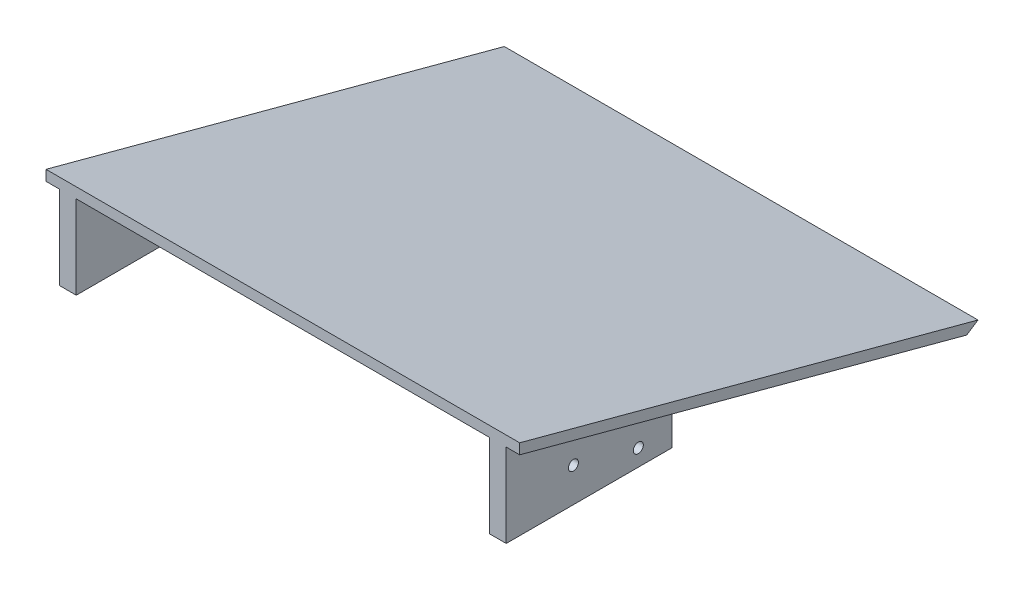
ISO-10303-21;
HEADER;
FILE_DESCRIPTION(('STEP AP214'),'2;1');
FILE_NAME('part.step','',(''),(''),'','','');
FILE_SCHEMA(('AUTOMOTIVE_DESIGN { 1 0 10303 214 1 1 1 1 }'));
ENDSEC;
DATA;
#1=APPLICATION_CONTEXT('core data for automotive mechanical design processes');
#2=APPLICATION_PROTOCOL_DEFINITION('international standard','automotive_design',2000,#1);
#3=PRODUCT_CONTEXT('',#1,'mechanical');
#4=PRODUCT('Part','Part','',(#3));
#5=PRODUCT_RELATED_PRODUCT_CATEGORY('part','',(#4));
#6=PRODUCT_DEFINITION_FORMATION('','',#4);
#7=PRODUCT_DEFINITION_CONTEXT('part definition',#1,'design');
#8=PRODUCT_DEFINITION('design','',#6,#7);
#9=PRODUCT_DEFINITION_SHAPE('','',#8);
#10=(LENGTH_UNIT() NAMED_UNIT(*) SI_UNIT(.MILLI.,.METRE.));
#11=(NAMED_UNIT(*) PLANE_ANGLE_UNIT() SI_UNIT($,.RADIAN.));
#12=(NAMED_UNIT(*) SI_UNIT($,.STERADIAN.) SOLID_ANGLE_UNIT());
#13=UNCERTAINTY_MEASURE_WITH_UNIT(LENGTH_MEASURE(1.E-05),#10,'distance_accuracy_value','');
#14=(GEOMETRIC_REPRESENTATION_CONTEXT(3) GLOBAL_UNCERTAINTY_ASSIGNED_CONTEXT((#13)) GLOBAL_UNIT_ASSIGNED_CONTEXT((#10,
#11,#12)) REPRESENTATION_CONTEXT('',''));
#15=CARTESIAN_POINT('',(0.,0.,0.));
#16=DIRECTION('',(0.,0.,1.));
#17=DIRECTION('',(1.,0.,0.));
#18=AXIS2_PLACEMENT_3D('',#15,#16,#17);
#19=CARTESIAN_POINT('',(70.5,3.10582854123023,0.));
#20=DIRECTION('',(0.,0.,-1.));
#21=DIRECTION('',(-1.,0.,0.));
#22=AXIS2_PLACEMENT_3D('',#19,#20,#21);
#23=PLANE('',#22);
#24=DIRECTION('',(0.,-1.,0.));
#25=VECTOR('',#24,1.);
#26=CARTESIAN_POINT('',(-70.5,3.10582854123023,0.));
#27=LINE('',#26,#25);
#28=CARTESIAN_POINT('',(-70.5,3.10582854123023,0.));
#29=VERTEX_POINT('',#28);
#30=CARTESIAN_POINT('',(-70.5,0.,0.));
#31=VERTEX_POINT('',#30);
#32=EDGE_CURVE('E196',#29,#31,#27,.T.);
#33=ORIENTED_EDGE('',*,*,#32,.T.);
#34=DIRECTION('',(-1.,0.,0.));
#35=VECTOR('',#34,1.);
#36=CARTESIAN_POINT('',(70.5,0.,0.));
#37=LINE('',#36,#35);
#38=CARTESIAN_POINT('',(-66.5,0.,0.));
#39=VERTEX_POINT('',#38);
#40=EDGE_CURVE('E42',#39,#31,#37,.T.);
#41=ORIENTED_EDGE('',*,*,#40,.F.);
#42=DIRECTION('',(0.,1.,0.));
#43=VECTOR('',#42,1.);
#44=CARTESIAN_POINT('',(-66.5,0.,0.));
#45=LINE('',#44,#43);
#46=CARTESIAN_POINT('',(-66.5,-24.8528503743635,0.));
#47=VERTEX_POINT('',#46);
#48=EDGE_CURVE('E176',#47,#39,#45,.T.);
#49=ORIENTED_EDGE('',*,*,#48,.F.);
#50=DIRECTION('',(-1.,0.,0.));
#51=VECTOR('',#50,1.);
#52=CARTESIAN_POINT('',(-61.5,-24.8528503743635,0.));
#53=LINE('',#52,#51);
#54=CARTESIAN_POINT('',(-61.5,-24.8528503743635,0.));
#55=VERTEX_POINT('',#54);
#56=EDGE_CURVE('E194',#55,#47,#53,.T.);
#57=ORIENTED_EDGE('',*,*,#56,.F.);
#58=DIRECTION('',(0.,1.,0.));
#59=VECTOR('',#58,1.);
#60=CARTESIAN_POINT('',(-61.5,0.,0.));
#61=LINE('',#60,#59);
#62=CARTESIAN_POINT('',(-61.5,0.,0.));
#63=VERTEX_POINT('',#62);
#64=EDGE_CURVE('E127',#55,#63,#61,.T.);
#65=ORIENTED_EDGE('',*,*,#64,.T.);
#66=CARTESIAN_POINT('',(61.5,0.,0.));
#67=VERTEX_POINT('',#66);
#68=EDGE_CURVE('E41',#67,#63,#37,.T.);
#69=ORIENTED_EDGE('',*,*,#68,.F.);
#70=DIRECTION('',(0.,1.,0.));
#71=VECTOR('',#70,1.);
#72=CARTESIAN_POINT('',(61.5,0.,0.));
#73=LINE('',#72,#71);
#74=CARTESIAN_POINT('',(61.5,-24.8528503743635,0.));
#75=VERTEX_POINT('',#74);
#76=EDGE_CURVE('E125',#75,#67,#73,.T.);
#77=ORIENTED_EDGE('',*,*,#76,.F.);
#78=DIRECTION('',(1.,0.,0.));
#79=VECTOR('',#78,1.);
#80=CARTESIAN_POINT('',(61.5,-24.8528503743635,0.));
#81=LINE('',#80,#79);
#82=CARTESIAN_POINT('',(66.5,-24.8528503743635,0.));
#83=VERTEX_POINT('',#82);
#84=EDGE_CURVE('E146',#75,#83,#81,.T.);
#85=ORIENTED_EDGE('',*,*,#84,.T.);
#86=DIRECTION('',(0.,1.,0.));
#87=VECTOR('',#86,1.);
#88=CARTESIAN_POINT('',(66.5,0.,0.));
#89=LINE('',#88,#87);
#90=CARTESIAN_POINT('',(66.5,0.,0.));
#91=VERTEX_POINT('',#90);
#92=EDGE_CURVE('E148',#83,#91,#89,.T.);
#93=ORIENTED_EDGE('',*,*,#92,.T.);
#94=CARTESIAN_POINT('',(70.5,0.,0.));
#95=VERTEX_POINT('',#94);
#96=EDGE_CURVE('E11',#95,#91,#37,.T.);
#97=ORIENTED_EDGE('',*,*,#96,.F.);
#98=DIRECTION('',(0.,-1.,0.));
#99=VECTOR('',#98,1.);
#100=CARTESIAN_POINT('',(70.5,3.10582854123023,0.));
#101=LINE('',#100,#99);
#102=CARTESIAN_POINT('',(70.5,3.10582854123023,0.));
#103=VERTEX_POINT('',#102);
#104=EDGE_CURVE('E200',#103,#95,#101,.T.);
#105=ORIENTED_EDGE('',*,*,#104,.F.);
#106=DIRECTION('',(-1.,0.,0.));
#107=VECTOR('',#106,1.);
#108=CARTESIAN_POINT('',(70.5,3.10582854123023,0.));
#109=LINE('',#108,#107);
#110=EDGE_CURVE('E210',#103,#29,#109,.T.);
#111=ORIENTED_EDGE('',*,*,#110,.T.);
#112=EDGE_LOOP('',(#33,#41,#49,#57,#65,#69,#77,#85,#93,#97,#105,#111));
#113=FACE_BOUND('',#112,.T.);
#114=ADVANCED_FACE('F34',(#113),#23,.F.);
#115=CARTESIAN_POINT('',(70.5,0.,0.));
#116=DIRECTION('',(0.,0.965925826289069,-0.258819045102518));
#117=DIRECTION('',(0.,0.258819045102518,0.965925826289069));
#118=AXIS2_PLACEMENT_3D('',#115,#116,#117);
#119=PLANE('',#118);
#120=DIRECTION('',(1.,0.,0.));
#121=VECTOR('',#120,1.);
#122=CARTESIAN_POINT('',(61.5,-13.2148566749839,-49.3185165257814));
#123=LINE('',#122,#121);
#124=CARTESIAN_POINT('',(61.5,-13.2148566749839,-49.3185165257814));
#125=VERTEX_POINT('',#124);
#126=CARTESIAN_POINT('',(66.5,-13.2148566749839,-49.3185165257814));
#127=VERTEX_POINT('',#126);
#128=EDGE_CURVE('E53',#125,#127,#123,.T.);
#129=ORIENTED_EDGE('',*,*,#128,.F.);
#130=DIRECTION('',(0.,-0.258819045102518,-0.965925826289069));
#131=VECTOR('',#130,1.);
#132=CARTESIAN_POINT('',(61.5,-13.2148566749839,-49.3185165257814));
#133=LINE('',#132,#131);
#134=EDGE_CURVE('E130',#67,#125,#133,.T.);
#135=ORIENTED_EDGE('',*,*,#134,.F.);
#136=ORIENTED_EDGE('',*,*,#68,.T.);
#137=DIRECTION('',(0.,-0.258819045102518,-0.965925826289069));
#138=VECTOR('',#137,1.);
#139=CARTESIAN_POINT('',(-61.5,-13.2148566749839,-49.3185165257814));
#140=LINE('',#139,#138);
#141=CARTESIAN_POINT('',(-61.5,-13.2148566749839,-49.3185165257814));
#142=VERTEX_POINT('',#141);
#143=EDGE_CURVE('E173',#63,#142,#140,.T.);
#144=ORIENTED_EDGE('',*,*,#143,.T.);
#145=DIRECTION('',(-1.,0.,0.));
#146=VECTOR('',#145,1.);
#147=CARTESIAN_POINT('',(-61.5,-13.2148566749839,-49.3185165257814));
#148=LINE('',#147,#146);
#149=CARTESIAN_POINT('',(-66.5,-13.2148566749839,-49.3185165257814));
#150=VERTEX_POINT('',#149);
#151=EDGE_CURVE('E183',#142,#150,#148,.T.);
#152=ORIENTED_EDGE('',*,*,#151,.T.);
#153=DIRECTION('',(0.,-0.258819045102518,-0.965925826289069));
#154=VECTOR('',#153,1.);
#155=CARTESIAN_POINT('',(-66.5,-13.2148566749839,-49.3185165257814));
#156=LINE('',#155,#154);
#157=EDGE_CURVE('E170',#39,#150,#156,.T.);
#158=ORIENTED_EDGE('',*,*,#157,.F.);
#159=ORIENTED_EDGE('',*,*,#40,.T.);
#160=DIRECTION('',(0.,-0.258819045102518,-0.965925826289069));
#161=VECTOR('',#160,1.);
#162=CARTESIAN_POINT('',(-70.5,0.,0.));
#163=LINE('',#162,#161);
#164=CARTESIAN_POINT('',(-70.5,-35.6497352724208,-133.046623313056));
#165=VERTEX_POINT('',#164);
#166=EDGE_CURVE('E212',#31,#165,#163,.T.);
#167=ORIENTED_EDGE('',*,*,#166,.T.);
#168=DIRECTION('',(-1.,0.,0.));
#169=VECTOR('',#168,1.);
#170=CARTESIAN_POINT('',(70.5,-35.6497352724208,-133.046623313056));
#171=LINE('',#170,#169);
#172=CARTESIAN_POINT('',(70.5,-35.6497352724208,-133.046623313056));
#173=VERTEX_POINT('',#172);
#174=EDGE_CURVE('E221',#173,#165,#171,.T.);
#175=ORIENTED_EDGE('',*,*,#174,.F.);
#176=DIRECTION('',(0.,-0.258819045102518,-0.965925826289069));
#177=VECTOR('',#176,1.);
#178=CARTESIAN_POINT('',(70.5,0.,0.));
#179=LINE('',#178,#177);
#180=EDGE_CURVE('E203',#95,#173,#179,.T.);
#181=ORIENTED_EDGE('',*,*,#180,.F.);
#182=ORIENTED_EDGE('',*,*,#96,.T.);
#183=DIRECTION('',(0.,-0.258819045102518,-0.965925826289069));
#184=VECTOR('',#183,1.);
#185=CARTESIAN_POINT('',(66.5,-13.2148566749839,-49.3185165257814));
#186=LINE('',#185,#184);
#187=EDGE_CURVE('E48',#91,#127,#186,.T.);
#188=ORIENTED_EDGE('',*,*,#187,.T.);
#189=EDGE_LOOP('',(#129,#135,#136,#144,#152,#158,#159,#167,#175,#181,#182,#188));
#190=FACE_BOUND('',#189,.T.);
#191=ADVANCED_FACE('F131',(#190),#119,.F.);
#192=CARTESIAN_POINT('',(70.5,-35.6497352724208,-133.046623313056));
#193=DIRECTION('',(0.,0.83867056794542,0.544639035015034));
#194=DIRECTION('',(0.,-0.544639035015034,0.83867056794542));
#195=AXIS2_PLACEMENT_3D('',#192,#193,#194);
#196=PLANE('',#195);
#197=DIRECTION('',(0.,0.544639035015034,-0.83867056794542));
#198=VECTOR('',#197,1.);
#199=CARTESIAN_POINT('',(-70.5,-35.6497352724208,-133.046623313056));
#200=LINE('',#199,#198);
#201=CARTESIAN_POINT('',(-70.5,-33.4510829384084,-136.432251009811));
#202=VERTEX_POINT('',#201);
#203=EDGE_CURVE('E214',#165,#202,#200,.T.);
#204=ORIENTED_EDGE('',*,*,#203,.T.);
#205=DIRECTION('',(-1.,0.,0.));
#206=VECTOR('',#205,1.);
#207=CARTESIAN_POINT('',(70.5,-33.4510829384084,-136.432251009811));
#208=LINE('',#207,#206);
#209=CARTESIAN_POINT('',(70.5,-33.4510829384084,-136.432251009811));
#210=VERTEX_POINT('',#209);
#211=EDGE_CURVE('E219',#210,#202,#208,.T.);
#212=ORIENTED_EDGE('',*,*,#211,.F.);
#213=DIRECTION('',(0.,0.544639035015034,-0.83867056794542));
#214=VECTOR('',#213,1.);
#215=CARTESIAN_POINT('',(70.5,-35.6497352724208,-133.046623313056));
#216=LINE('',#215,#214);
#217=EDGE_CURVE('E206',#173,#210,#216,.T.);
#218=ORIENTED_EDGE('',*,*,#217,.F.);
#219=ORIENTED_EDGE('',*,*,#174,.T.);
#220=EDGE_LOOP('',(#204,#212,#218,#219));
#221=FACE_BOUND('',#220,.T.);
#222=ADVANCED_FACE('F241',(#221),#196,.F.);
#223=CARTESIAN_POINT('',(70.5,-33.4510829384084,-136.432251009811));
#224=DIRECTION('',(0.,-0.965925826289069,0.258819045102518));
#225=DIRECTION('',(0.,-0.258819045102518,-0.965925826289069));
#226=AXIS2_PLACEMENT_3D('',#223,#224,#225);
#227=PLANE('',#226);
#228=DIRECTION('',(0.,0.258819045102518,0.965925826289069));
#229=VECTOR('',#228,1.);
#230=CARTESIAN_POINT('',(-70.5,-33.4510829384084,-136.432251009811));
#231=LINE('',#230,#229);
#232=EDGE_CURVE('E204',#202,#29,#231,.T.);
#233=ORIENTED_EDGE('',*,*,#232,.T.);
#234=ORIENTED_EDGE('',*,*,#110,.F.);
#235=DIRECTION('',(0.,0.258819045102518,0.965925826289069));
#236=VECTOR('',#235,1.);
#237=CARTESIAN_POINT('',(70.5,-33.4510829384084,-136.432251009811));
#238=LINE('',#237,#236);
#239=EDGE_CURVE('E208',#210,#103,#238,.T.);
#240=ORIENTED_EDGE('',*,*,#239,.F.);
#241=ORIENTED_EDGE('',*,*,#211,.T.);
#242=EDGE_LOOP('',(#233,#234,#240,#241));
#243=FACE_BOUND('',#242,.T.);
#244=ADVANCED_FACE('F239',(#243),#227,.F.);
#245=CARTESIAN_POINT('',(70.5,0.,0.));
#246=DIRECTION('',(1.,0.,0.));
#247=DIRECTION('',(0.,0.,-1.));
#248=AXIS2_PLACEMENT_3D('',#245,#246,#247);
#249=PLANE('',#248);
#250=ORIENTED_EDGE('',*,*,#104,.T.);
#251=ORIENTED_EDGE('',*,*,#180,.T.);
#252=ORIENTED_EDGE('',*,*,#217,.T.);
#253=ORIENTED_EDGE('',*,*,#239,.T.);
#254=EDGE_LOOP('',(#250,#251,#252,#253));
#255=FACE_BOUND('',#254,.T.);
#256=ADVANCED_FACE('F243',(#255),#249,.T.);
#257=CARTESIAN_POINT('',(-70.5,0.,0.));
#258=DIRECTION('',(1.,0.,0.));
#259=DIRECTION('',(0.,0.,-1.));
#260=AXIS2_PLACEMENT_3D('',#257,#258,#259);
#261=PLANE('',#260);
#262=ORIENTED_EDGE('',*,*,#32,.F.);
#263=ORIENTED_EDGE('',*,*,#232,.F.);
#264=ORIENTED_EDGE('',*,*,#203,.F.);
#265=ORIENTED_EDGE('',*,*,#166,.F.);
#266=EDGE_LOOP('',(#262,#263,#264,#265));
#267=FACE_BOUND('',#266,.T.);
#268=ADVANCED_FACE('F232',(#267),#261,.F.);
#269=CARTESIAN_POINT('',(-61.5,-24.8528503743635,0.));
#270=DIRECTION('',(0.,-1.,0.));
#271=DIRECTION('',(0.,0.,-1.));
#272=AXIS2_PLACEMENT_3D('',#269,#270,#271);
#273=PLANE('',#272);
#274=DIRECTION('',(0.,0.,1.));
#275=VECTOR('',#274,1.);
#276=CARTESIAN_POINT('',(-66.5,-24.8528503743635,0.));
#277=LINE('',#276,#275);
#278=CARTESIAN_POINT('',(-66.5,-24.8528503743635,-49.3185165257814));
#279=VERTEX_POINT('',#278);
#280=EDGE_CURVE('E189',#279,#47,#277,.T.);
#281=ORIENTED_EDGE('',*,*,#280,.F.);
#282=DIRECTION('',(-1.,0.,0.));
#283=VECTOR('',#282,1.);
#284=CARTESIAN_POINT('',(-61.5,-24.8528503743635,-49.3185165257814));
#285=LINE('',#284,#283);
#286=CARTESIAN_POINT('',(-61.5,-24.8528503743635,-49.3185165257814));
#287=VERTEX_POINT('',#286);
#288=EDGE_CURVE('E197',#287,#279,#285,.T.);
#289=ORIENTED_EDGE('',*,*,#288,.F.);
#290=DIRECTION('',(0.,0.,1.));
#291=VECTOR('',#290,1.);
#292=CARTESIAN_POINT('',(-61.5,-24.8528503743635,0.));
#293=LINE('',#292,#291);
#294=EDGE_CURVE('E179',#287,#55,#293,.T.);
#295=ORIENTED_EDGE('',*,*,#294,.T.);
#296=ORIENTED_EDGE('',*,*,#56,.T.);
#297=EDGE_LOOP('',(#281,#289,#295,#296));
#298=FACE_BOUND('',#297,.T.);
#299=ADVANCED_FACE('F279',(#298),#273,.T.);
#300=CARTESIAN_POINT('',(-61.5,-24.8528503743635,-49.3185165257814));
#301=DIRECTION('',(0.,0.,-1.));
#302=DIRECTION('',(-1.,0.,0.));
#303=AXIS2_PLACEMENT_3D('',#300,#301,#302);
#304=PLANE('',#303);
#305=DIRECTION('',(0.,-1.,0.));
#306=VECTOR('',#305,1.);
#307=CARTESIAN_POINT('',(-66.5,-24.8528503743635,-49.3185165257814));
#308=LINE('',#307,#306);
#309=EDGE_CURVE('E186',#150,#279,#308,.T.);
#310=ORIENTED_EDGE('',*,*,#309,.F.);
#311=ORIENTED_EDGE('',*,*,#151,.F.);
#312=DIRECTION('',(0.,-1.,0.));
#313=VECTOR('',#312,1.);
#314=CARTESIAN_POINT('',(-61.5,-24.8528503743635,-49.3185165257814));
#315=LINE('',#314,#313);
#316=EDGE_CURVE('E175',#142,#287,#315,.T.);
#317=ORIENTED_EDGE('',*,*,#316,.T.);
#318=ORIENTED_EDGE('',*,*,#288,.T.);
#319=EDGE_LOOP('',(#310,#311,#317,#318));
#320=FACE_BOUND('',#319,.T.);
#321=ADVANCED_FACE('F282',(#320),#304,.T.);
#322=CARTESIAN_POINT('',(-61.5,0.,0.));
#323=DIRECTION('',(1.,0.,0.));
#324=DIRECTION('',(0.,0.,-1.));
#325=AXIS2_PLACEMENT_3D('',#322,#323,#324);
#326=PLANE('',#325);
#327=CARTESIAN_POINT('',(-61.5,-19.8528503743635,-39.3185165257814));
#328=DIRECTION('',(-1.,0.,0.));
#329=DIRECTION('',(0.,0.,1.));
#330=AXIS2_PLACEMENT_3D('',#327,#328,#329);
#331=CIRCLE('',#330,1.5);
#332=CARTESIAN_POINT('',(-61.5,-19.8528503743635,-37.8185165257814));
#333=VERTEX_POINT('',#332);
#334=EDGE_CURVE('E161',#333,#333,#331,.T.);
#335=ORIENTED_EDGE('',*,*,#334,.T.);
#336=EDGE_LOOP('',(#335));
#337=FACE_BOUND('',#336,.T.);
#338=CARTESIAN_POINT('',(-61.5,-14.6764694723131,-20.));
#339=DIRECTION('',(-1.,0.,0.));
#340=DIRECTION('',(0.,0.,1.));
#341=AXIS2_PLACEMENT_3D('',#338,#339,#340);
#342=CIRCLE('',#341,1.5);
#343=CARTESIAN_POINT('',(-61.5,-14.6764694723131,-18.5));
#344=VERTEX_POINT('',#343);
#345=EDGE_CURVE('E167',#344,#344,#342,.T.);
#346=ORIENTED_EDGE('',*,*,#345,.T.);
#347=EDGE_LOOP('',(#346));
#348=FACE_BOUND('',#347,.T.);
#349=ORIENTED_EDGE('',*,*,#143,.F.);
#350=ORIENTED_EDGE('',*,*,#64,.F.);
#351=ORIENTED_EDGE('',*,*,#294,.F.);
#352=ORIENTED_EDGE('',*,*,#316,.F.);
#353=EDGE_LOOP('',(#349,#350,#351,#352));
#354=FACE_BOUND('',#353,.T.);
#355=ADVANCED_FACE('F285',(#337,#348,#354),#326,.T.);
#356=CARTESIAN_POINT('',(-66.5,0.,0.));
#357=DIRECTION('',(1.,0.,0.));
#358=DIRECTION('',(0.,0.,-1.));
#359=AXIS2_PLACEMENT_3D('',#356,#357,#358);
#360=PLANE('',#359);
#361=CARTESIAN_POINT('',(-66.5,-19.8528503743635,-39.3185165257814));
#362=DIRECTION('',(-1.,0.,0.));
#363=DIRECTION('',(0.,0.,1.));
#364=AXIS2_PLACEMENT_3D('',#361,#362,#363);
#365=CIRCLE('',#364,1.5);
#366=CARTESIAN_POINT('',(-66.5,-19.8528503743635,-37.8185165257814));
#367=VERTEX_POINT('',#366);
#368=EDGE_CURVE('E156',#367,#367,#365,.T.);
#369=ORIENTED_EDGE('',*,*,#368,.F.);
#370=EDGE_LOOP('',(#369));
#371=FACE_BOUND('',#370,.T.);
#372=CARTESIAN_POINT('',(-66.5,-14.6764694723131,-20.));
#373=DIRECTION('',(-1.,0.,0.));
#374=DIRECTION('',(0.,0.,1.));
#375=AXIS2_PLACEMENT_3D('',#372,#373,#374);
#376=CIRCLE('',#375,1.5);
#377=CARTESIAN_POINT('',(-66.5,-14.6764694723131,-18.5));
#378=VERTEX_POINT('',#377);
#379=EDGE_CURVE('E164',#378,#378,#376,.T.);
#380=ORIENTED_EDGE('',*,*,#379,.F.);
#381=EDGE_LOOP('',(#380));
#382=FACE_BOUND('',#381,.T.);
#383=ORIENTED_EDGE('',*,*,#157,.T.);
#384=ORIENTED_EDGE('',*,*,#309,.T.);
#385=ORIENTED_EDGE('',*,*,#280,.T.);
#386=ORIENTED_EDGE('',*,*,#48,.T.);
#387=EDGE_LOOP('',(#383,#384,#385,#386));
#388=FACE_BOUND('',#387,.T.);
#389=ADVANCED_FACE('F290',(#371,#382,#388),#360,.F.);
#390=CARTESIAN_POINT('',(-61.5,-14.6764694723131,-20.));
#391=DIRECTION('',(-1.,0.,0.));
#392=DIRECTION('',(0.,0.,1.));
#393=AXIS2_PLACEMENT_3D('',#390,#391,#392);
#394=CYLINDRICAL_SURFACE('',#393,1.5);
#395=ORIENTED_EDGE('',*,*,#345,.F.);
#396=EDGE_LOOP('',(#395));
#397=FACE_BOUND('',#396,.T.);
#398=ORIENTED_EDGE('',*,*,#379,.T.);
#399=EDGE_LOOP('',(#398));
#400=FACE_BOUND('',#399,.T.);
#401=ADVANCED_FACE('F293',(#397,#400),#394,.F.);
#402=CARTESIAN_POINT('',(-61.5,-19.8528503743635,-39.3185165257814));
#403=DIRECTION('',(-1.,0.,0.));
#404=DIRECTION('',(0.,0.,1.));
#405=AXIS2_PLACEMENT_3D('',#402,#403,#404);
#406=CYLINDRICAL_SURFACE('',#405,1.5);
#407=ORIENTED_EDGE('',*,*,#334,.F.);
#408=EDGE_LOOP('',(#407));
#409=FACE_BOUND('',#408,.T.);
#410=ORIENTED_EDGE('',*,*,#368,.T.);
#411=EDGE_LOOP('',(#410));
#412=FACE_BOUND('',#411,.T.);
#413=ADVANCED_FACE('F299',(#409,#412),#406,.F.);
#414=CARTESIAN_POINT('',(61.5,0.,0.));
#415=DIRECTION('',(-1.,0.,0.));
#416=DIRECTION('',(0.,0.,-1.));
#417=AXIS2_PLACEMENT_3D('',#414,#415,#416);
#418=PLANE('',#417);
#419=CARTESIAN_POINT('',(61.5,-14.6764694723131,-20.));
#420=DIRECTION('',(-1.,0.,0.));
#421=DIRECTION('',(0.,0.,1.));
#422=AXIS2_PLACEMENT_3D('',#419,#420,#421);
#423=CIRCLE('',#422,1.5);
#424=CARTESIAN_POINT('',(61.5,-14.6764694723131,-18.5));
#425=VERTEX_POINT('',#424);
#426=EDGE_CURVE('E149',#425,#425,#423,.T.);
#427=ORIENTED_EDGE('',*,*,#426,.F.);
#428=EDGE_LOOP('',(#427));
#429=FACE_BOUND('',#428,.T.);
#430=ORIENTED_EDGE('',*,*,#134,.T.);
#431=DIRECTION('',(0.,-1.,0.));
#432=VECTOR('',#431,1.);
#433=CARTESIAN_POINT('',(61.5,-24.8528503743635,-49.3185165257814));
#434=LINE('',#433,#432);
#435=CARTESIAN_POINT('',(61.5,-24.8528503743635,-49.3185165257814));
#436=VERTEX_POINT('',#435);
#437=EDGE_CURVE('E141',#125,#436,#434,.T.);
#438=ORIENTED_EDGE('',*,*,#437,.T.);
#439=DIRECTION('',(0.,0.,1.));
#440=VECTOR('',#439,1.);
#441=CARTESIAN_POINT('',(61.5,-24.8528503743635,0.));
#442=LINE('',#441,#440);
#443=EDGE_CURVE('E138',#436,#75,#442,.T.);
#444=ORIENTED_EDGE('',*,*,#443,.T.);
#445=ORIENTED_EDGE('',*,*,#76,.T.);
#446=EDGE_LOOP('',(#430,#438,#444,#445));
#447=FACE_BOUND('',#446,.T.);
#448=CARTESIAN_POINT('',(61.5,-19.8528503743635,-39.3185165257814));
#449=DIRECTION('',(-1.,0.,0.));
#450=DIRECTION('',(0.,0.,1.));
#451=AXIS2_PLACEMENT_3D('',#448,#449,#450);
#452=CIRCLE('',#451,1.5);
#453=CARTESIAN_POINT('',(61.5,-19.8528503743635,-37.8185165257814));
#454=VERTEX_POINT('',#453);
#455=EDGE_CURVE('E336',#454,#454,#452,.T.);
#456=ORIENTED_EDGE('',*,*,#455,.F.);
#457=EDGE_LOOP('',(#456));
#458=FACE_BOUND('',#457,.T.);
#459=ADVANCED_FACE('F135',(#429,#447,#458),#418,.T.);
#460=CARTESIAN_POINT('',(66.5,0.,0.));
#461=DIRECTION('',(-1.,0.,0.));
#462=DIRECTION('',(0.,0.,-1.));
#463=AXIS2_PLACEMENT_3D('',#460,#461,#462);
#464=PLANE('',#463);
#465=ORIENTED_EDGE('',*,*,#187,.F.);
#466=ORIENTED_EDGE('',*,*,#92,.F.);
#467=DIRECTION('',(0.,0.,1.));
#468=VECTOR('',#467,1.);
#469=CARTESIAN_POINT('',(66.5,-24.8528503743635,0.));
#470=LINE('',#469,#468);
#471=CARTESIAN_POINT('',(66.5,-24.8528503743635,-49.3185165257814));
#472=VERTEX_POINT('',#471);
#473=EDGE_CURVE('E152',#472,#83,#470,.T.);
#474=ORIENTED_EDGE('',*,*,#473,.F.);
#475=DIRECTION('',(0.,-1.,0.));
#476=VECTOR('',#475,1.);
#477=CARTESIAN_POINT('',(66.5,-24.8528503743635,-49.3185165257814));
#478=LINE('',#477,#476);
#479=EDGE_CURVE('E133',#127,#472,#478,.T.);
#480=ORIENTED_EDGE('',*,*,#479,.F.);
#481=EDGE_LOOP('',(#465,#466,#474,#480));
#482=FACE_BOUND('',#481,.T.);
#483=CARTESIAN_POINT('',(66.5,-14.6764694723131,-20.));
#484=DIRECTION('',(-1.,0.,0.));
#485=DIRECTION('',(0.,0.,1.));
#486=AXIS2_PLACEMENT_3D('',#483,#484,#485);
#487=CIRCLE('',#486,1.5);
#488=CARTESIAN_POINT('',(66.5,-14.6764694723131,-18.5));
#489=VERTEX_POINT('',#488);
#490=EDGE_CURVE('E342',#489,#489,#487,.T.);
#491=ORIENTED_EDGE('',*,*,#490,.T.);
#492=EDGE_LOOP('',(#491));
#493=FACE_BOUND('',#492,.T.);
#494=CARTESIAN_POINT('',(66.5,-19.8528503743635,-39.3185165257814));
#495=DIRECTION('',(-1.,0.,0.));
#496=DIRECTION('',(0.,0.,1.));
#497=AXIS2_PLACEMENT_3D('',#494,#495,#496);
#498=CIRCLE('',#497,1.5);
#499=CARTESIAN_POINT('',(66.5,-19.8528503743635,-37.8185165257814));
#500=VERTEX_POINT('',#499);
#501=EDGE_CURVE('E339',#500,#500,#498,.T.);
#502=ORIENTED_EDGE('',*,*,#501,.T.);
#503=EDGE_LOOP('',(#502));
#504=FACE_BOUND('',#503,.T.);
#505=ADVANCED_FACE('F247',(#482,#493,#504),#464,.F.);
#506=CARTESIAN_POINT('',(61.5,-24.8528503743635,-49.3185165257814));
#507=DIRECTION('',(0.,0.,1.));
#508=DIRECTION('',(1.,0.,0.));
#509=AXIS2_PLACEMENT_3D('',#506,#507,#508);
#510=PLANE('',#509);
#511=ORIENTED_EDGE('',*,*,#479,.T.);
#512=DIRECTION('',(1.,0.,0.));
#513=VECTOR('',#512,1.);
#514=CARTESIAN_POINT('',(61.5,-24.8528503743635,-49.3185165257814));
#515=LINE('',#514,#513);
#516=EDGE_CURVE('E157',#436,#472,#515,.T.);
#517=ORIENTED_EDGE('',*,*,#516,.F.);
#518=ORIENTED_EDGE('',*,*,#437,.F.);
#519=ORIENTED_EDGE('',*,*,#128,.T.);
#520=EDGE_LOOP('',(#511,#517,#518,#519));
#521=FACE_BOUND('',#520,.T.);
#522=ADVANCED_FACE('F251',(#521),#510,.F.);
#523=CARTESIAN_POINT('',(61.5,-24.8528503743635,0.));
#524=DIRECTION('',(0.,1.,0.));
#525=DIRECTION('',(0.,0.,1.));
#526=AXIS2_PLACEMENT_3D('',#523,#524,#525);
#527=PLANE('',#526);
#528=ORIENTED_EDGE('',*,*,#473,.T.);
#529=ORIENTED_EDGE('',*,*,#84,.F.);
#530=ORIENTED_EDGE('',*,*,#443,.F.);
#531=ORIENTED_EDGE('',*,*,#516,.T.);
#532=EDGE_LOOP('',(#528,#529,#530,#531));
#533=FACE_BOUND('',#532,.T.);
#534=ADVANCED_FACE('F253',(#533),#527,.F.);
#535=CARTESIAN_POINT('',(61.5,-14.6764694723131,-20.));
#536=DIRECTION('',(1.,0.,0.));
#537=DIRECTION('',(0.,0.,-1.));
#538=AXIS2_PLACEMENT_3D('',#535,#536,#537);
#539=CYLINDRICAL_SURFACE('',#538,1.5);
#540=ORIENTED_EDGE('',*,*,#426,.T.);
#541=EDGE_LOOP('',(#540));
#542=FACE_BOUND('',#541,.T.);
#543=ORIENTED_EDGE('',*,*,#490,.F.);
#544=EDGE_LOOP('',(#543));
#545=FACE_BOUND('',#544,.T.);
#546=ADVANCED_FACE('F255',(#542,#545),#539,.F.);
#547=CARTESIAN_POINT('',(61.5,-19.8528503743635,-39.3185165257814));
#548=DIRECTION('',(1.,0.,0.));
#549=DIRECTION('',(0.,0.,-1.));
#550=AXIS2_PLACEMENT_3D('',#547,#548,#549);
#551=CYLINDRICAL_SURFACE('',#550,1.5);
#552=ORIENTED_EDGE('',*,*,#455,.T.);
#553=EDGE_LOOP('',(#552));
#554=FACE_BOUND('',#553,.T.);
#555=ORIENTED_EDGE('',*,*,#501,.F.);
#556=EDGE_LOOP('',(#555));
#557=FACE_BOUND('',#556,.T.);
#558=ADVANCED_FACE('F261',(#554,#557),#551,.F.);
#559=CLOSED_SHELL('',(#114,#191,#222,#244,#256,#268,#299,#321,#355,#389,#401,#413,#459,#505,
#522,#534,#546,#558));
#560=MANIFOLD_SOLID_BREP('B2',#559);
#561=ADVANCED_BREP_SHAPE_REPRESENTATION('',(#18,#560),#14);
#562=SHAPE_DEFINITION_REPRESENTATION(#9,#561);
ENDSEC;
END-ISO-10303-21;
